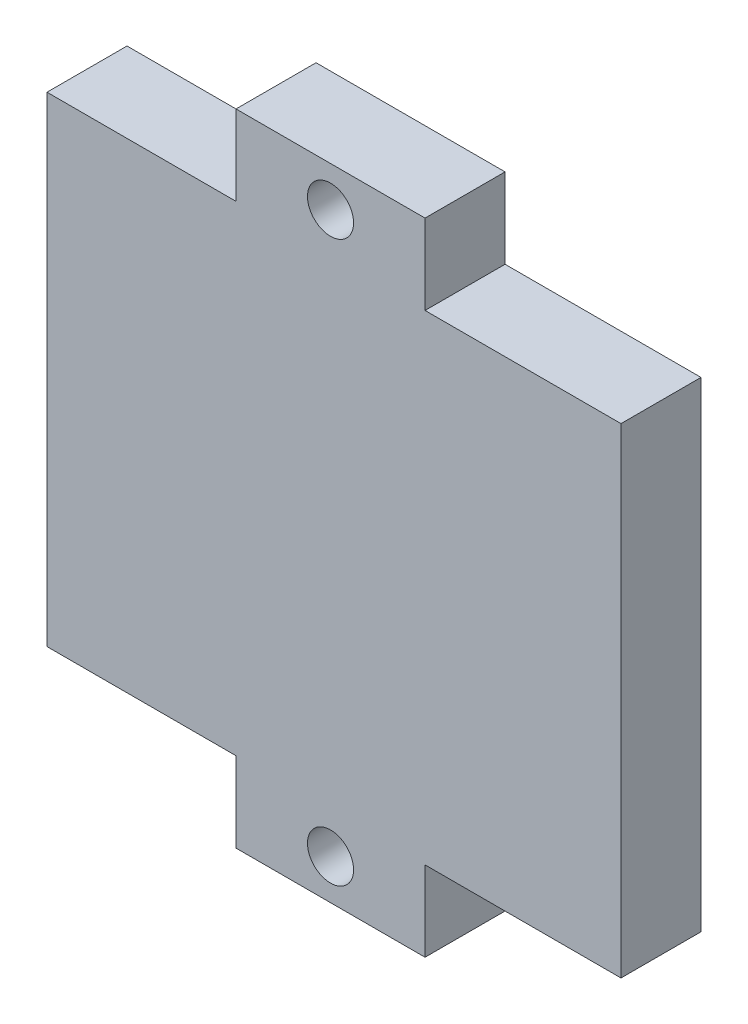
ISO-10303-21;
HEADER;
FILE_DESCRIPTION(('STEP AP214'),'2;1');
FILE_NAME('part.step','',(''),(''),'','','');
FILE_SCHEMA(('AUTOMOTIVE_DESIGN { 1 0 10303 214 1 1 1 1 }'));
ENDSEC;
DATA;
#1=APPLICATION_CONTEXT('core data for automotive mechanical design processes');
#2=APPLICATION_PROTOCOL_DEFINITION('international standard','automotive_design',2000,#1);
#3=PRODUCT_CONTEXT('',#1,'mechanical');
#4=PRODUCT('Part','Part','',(#3));
#5=PRODUCT_RELATED_PRODUCT_CATEGORY('part','',(#4));
#6=PRODUCT_DEFINITION_FORMATION('','',#4);
#7=PRODUCT_DEFINITION_CONTEXT('part definition',#1,'design');
#8=PRODUCT_DEFINITION('design','',#6,#7);
#9=PRODUCT_DEFINITION_SHAPE('','',#8);
#10=(LENGTH_UNIT() NAMED_UNIT(*) SI_UNIT(.MILLI.,.METRE.));
#11=(NAMED_UNIT(*) PLANE_ANGLE_UNIT() SI_UNIT($,.RADIAN.));
#12=(NAMED_UNIT(*) SI_UNIT($,.STERADIAN.) SOLID_ANGLE_UNIT());
#13=UNCERTAINTY_MEASURE_WITH_UNIT(LENGTH_MEASURE(1.E-05),#10,'distance_accuracy_value','');
#14=(GEOMETRIC_REPRESENTATION_CONTEXT(3) GLOBAL_UNCERTAINTY_ASSIGNED_CONTEXT((#13)) GLOBAL_UNIT_ASSIGNED_CONTEXT((#10,
#11,#12)) REPRESENTATION_CONTEXT('',''));
#15=CARTESIAN_POINT('',(0.,0.,0.));
#16=DIRECTION('',(0.,0.,1.));
#17=DIRECTION('',(1.,0.,0.));
#18=AXIS2_PLACEMENT_3D('',#15,#16,#17);
#19=CARTESIAN_POINT('',(0.,0.,6.35));
#20=DIRECTION('',(0.,0.,-1.));
#21=DIRECTION('',(-1.,0.,0.));
#22=AXIS2_PLACEMENT_3D('',#19,#20,#21);
#23=PLANE('',#22);
#24=CARTESIAN_POINT('',(-0.274999999999977,22.225,6.35));
#25=DIRECTION('',(0.,0.,1.));
#26=DIRECTION('',(1.,0.,0.));
#27=AXIS2_PLACEMENT_3D('',#24,#25,#26);
#28=CIRCLE('',#27,1.82879999999999);
#29=CARTESIAN_POINT('',(1.55380000000001,22.225,6.35));
#30=VERTEX_POINT('',#29);
#31=EDGE_CURVE('E254',#30,#30,#28,.T.);
#32=ORIENTED_EDGE('',*,*,#31,.F.);
#33=EDGE_LOOP('',(#32));
#34=FACE_BOUND('',#33,.T.);
#35=CARTESIAN_POINT('',(-0.274999999999977,-22.225,6.35));
#36=DIRECTION('',(0.,0.,1.));
#37=DIRECTION('',(1.,0.,0.));
#38=AXIS2_PLACEMENT_3D('',#35,#36,#37);
#39=CIRCLE('',#38,1.82879999999999);
#40=CARTESIAN_POINT('',(1.55380000000001,-22.225,6.35));
#41=VERTEX_POINT('',#40);
#42=EDGE_CURVE('E219',#41,#41,#39,.T.);
#43=ORIENTED_EDGE('',*,*,#42,.F.);
#44=EDGE_LOOP('',(#43));
#45=FACE_BOUND('',#44,.T.);
#46=DIRECTION('',(-1.,0.,0.));
#47=VECTOR('',#46,1.);
#48=CARTESIAN_POINT('',(22.775,19.05,6.35));
#49=LINE('',#48,#47);
#50=CARTESIAN_POINT('',(22.775,19.05,6.35));
#51=VERTEX_POINT('',#50);
#52=CARTESIAN_POINT('',(7.22500000000002,19.05,6.35));
#53=VERTEX_POINT('',#52);
#54=EDGE_CURVE('E55',#51,#53,#49,.T.);
#55=ORIENTED_EDGE('',*,*,#54,.T.);
#56=DIRECTION('',(0.,1.,0.));
#57=VECTOR('',#56,1.);
#58=CARTESIAN_POINT('',(7.22500000000002,25.4,6.35));
#59=LINE('',#58,#57);
#60=CARTESIAN_POINT('',(7.22500000000002,25.4,6.35));
#61=VERTEX_POINT('',#60);
#62=EDGE_CURVE('E245',#53,#61,#59,.T.);
#63=ORIENTED_EDGE('',*,*,#62,.T.);
#64=DIRECTION('',(-1.,0.,0.));
#65=VECTOR('',#64,1.);
#66=CARTESIAN_POINT('',(-22.775,25.4,6.35));
#67=LINE('',#66,#65);
#68=CARTESIAN_POINT('',(-7.77499999999998,25.4,6.35));
#69=VERTEX_POINT('',#68);
#70=EDGE_CURVE('E155',#61,#69,#67,.T.);
#71=ORIENTED_EDGE('',*,*,#70,.T.);
#72=DIRECTION('',(0.,-1.,0.));
#73=VECTOR('',#72,1.);
#74=CARTESIAN_POINT('',(-7.77499999999998,25.4,6.35));
#75=LINE('',#74,#73);
#76=CARTESIAN_POINT('',(-7.77499999999998,19.05,6.35));
#77=VERTEX_POINT('',#76);
#78=EDGE_CURVE('E228',#69,#77,#75,.T.);
#79=ORIENTED_EDGE('',*,*,#78,.T.);
#80=DIRECTION('',(-1.,0.,0.));
#81=VECTOR('',#80,1.);
#82=CARTESIAN_POINT('',(-22.775,19.05,6.35));
#83=LINE('',#82,#81);
#84=CARTESIAN_POINT('',(-22.775,19.05,6.35));
#85=VERTEX_POINT('',#84);
#86=EDGE_CURVE('E233',#77,#85,#83,.T.);
#87=ORIENTED_EDGE('',*,*,#86,.T.);
#88=DIRECTION('',(0.,-1.,0.));
#89=VECTOR('',#88,1.);
#90=CARTESIAN_POINT('',(-22.775,-25.4,6.35));
#91=LINE('',#90,#89);
#92=CARTESIAN_POINT('',(-22.775,-19.05,6.35));
#93=VERTEX_POINT('',#92);
#94=EDGE_CURVE('E47',#85,#93,#91,.T.);
#95=ORIENTED_EDGE('',*,*,#94,.T.);
#96=DIRECTION('',(-1.,0.,0.));
#97=VECTOR('',#96,1.);
#98=CARTESIAN_POINT('',(-22.775,-19.05,6.35));
#99=LINE('',#98,#97);
#100=CARTESIAN_POINT('',(-7.77499999999998,-19.05,6.35));
#101=VERTEX_POINT('',#100);
#102=EDGE_CURVE('E187',#101,#93,#99,.T.);
#103=ORIENTED_EDGE('',*,*,#102,.F.);
#104=DIRECTION('',(0.,1.,0.));
#105=VECTOR('',#104,1.);
#106=CARTESIAN_POINT('',(-7.77499999999998,-25.4,6.35));
#107=LINE('',#106,#105);
#108=CARTESIAN_POINT('',(-7.77499999999998,-25.4,6.35));
#109=VERTEX_POINT('',#108);
#110=EDGE_CURVE('E191',#109,#101,#107,.T.);
#111=ORIENTED_EDGE('',*,*,#110,.F.);
#112=DIRECTION('',(1.,0.,0.));
#113=VECTOR('',#112,1.);
#114=CARTESIAN_POINT('',(-22.775,-25.4,6.35));
#115=LINE('',#114,#113);
#116=CARTESIAN_POINT('',(7.22500000000002,-25.4,6.35));
#117=VERTEX_POINT('',#116);
#118=EDGE_CURVE('E11',#109,#117,#115,.T.);
#119=ORIENTED_EDGE('',*,*,#118,.T.);
#120=DIRECTION('',(0.,-1.,0.));
#121=VECTOR('',#120,1.);
#122=CARTESIAN_POINT('',(7.22500000000002,-25.4,6.35));
#123=LINE('',#122,#121);
#124=CARTESIAN_POINT('',(7.22500000000002,-19.05,6.35));
#125=VERTEX_POINT('',#124);
#126=EDGE_CURVE('E206',#125,#117,#123,.T.);
#127=ORIENTED_EDGE('',*,*,#126,.F.);
#128=DIRECTION('',(-1.,0.,0.));
#129=VECTOR('',#128,1.);
#130=CARTESIAN_POINT('',(22.775,-19.05,6.35));
#131=LINE('',#130,#129);
#132=CARTESIAN_POINT('',(22.775,-19.05,6.35));
#133=VERTEX_POINT('',#132);
#134=EDGE_CURVE('E209',#133,#125,#131,.T.);
#135=ORIENTED_EDGE('',*,*,#134,.F.);
#136=DIRECTION('',(0.,1.,0.));
#137=VECTOR('',#136,1.);
#138=CARTESIAN_POINT('',(22.775,-25.4,6.35));
#139=LINE('',#138,#137);
#140=EDGE_CURVE('E177',#133,#51,#139,.T.);
#141=ORIENTED_EDGE('',*,*,#140,.T.);
#142=EDGE_LOOP('',(#55,#63,#71,#79,#87,#95,#103,#111,#119,#127,#135,#141));
#143=FACE_BOUND('',#142,.T.);
#144=ADVANCED_FACE('F38',(#34,#45,#143),#23,.F.);
#145=CARTESIAN_POINT('',(-22.775,25.4,6.35));
#146=DIRECTION('',(0.,-1.,0.));
#147=DIRECTION('',(0.,0.,-1.));
#148=AXIS2_PLACEMENT_3D('',#145,#146,#147);
#149=PLANE('',#148);
#150=DIRECTION('',(0.,0.,1.));
#151=VECTOR('',#150,1.);
#152=CARTESIAN_POINT('',(7.22500000000002,25.4,0.));
#153=LINE('',#152,#151);
#154=CARTESIAN_POINT('',(7.22500000000002,25.4,0.));
#155=VERTEX_POINT('',#154);
#156=EDGE_CURVE('E140',#155,#61,#153,.T.);
#157=ORIENTED_EDGE('',*,*,#156,.F.);
#158=DIRECTION('',(-1.,0.,0.));
#159=VECTOR('',#158,1.);
#160=CARTESIAN_POINT('',(-22.775,25.4,0.));
#161=LINE('',#160,#159);
#162=CARTESIAN_POINT('',(-7.77499999999998,25.4,0.));
#163=VERTEX_POINT('',#162);
#164=EDGE_CURVE('E153',#155,#163,#161,.T.);
#165=ORIENTED_EDGE('',*,*,#164,.T.);
#166=DIRECTION('',(0.,0.,1.));
#167=VECTOR('',#166,1.);
#168=CARTESIAN_POINT('',(-7.77499999999998,25.4,0.));
#169=LINE('',#168,#167);
#170=EDGE_CURVE('E222',#163,#69,#169,.T.);
#171=ORIENTED_EDGE('',*,*,#170,.T.);
#172=ORIENTED_EDGE('',*,*,#70,.F.);
#173=EDGE_LOOP('',(#157,#165,#171,#172));
#174=FACE_BOUND('',#173,.T.);
#175=ADVANCED_FACE('F151',(#174),#149,.F.);
#176=CARTESIAN_POINT('',(0.,0.,0.));
#177=DIRECTION('',(0.,0.,-1.));
#178=DIRECTION('',(-1.,0.,0.));
#179=AXIS2_PLACEMENT_3D('',#176,#177,#178);
#180=PLANE('',#179);
#181=CARTESIAN_POINT('',(-0.274999999999977,22.225,0.));
#182=DIRECTION('',(0.,0.,-1.));
#183=DIRECTION('',(-1.,0.,0.));
#184=AXIS2_PLACEMENT_3D('',#181,#182,#183);
#185=CIRCLE('',#184,1.82879999999999);
#186=CARTESIAN_POINT('',(-2.10379999999997,22.225,0.));
#187=VERTEX_POINT('',#186);
#188=EDGE_CURVE('E248',#187,#187,#185,.T.);
#189=ORIENTED_EDGE('',*,*,#188,.F.);
#190=EDGE_LOOP('',(#189));
#191=FACE_BOUND('',#190,.T.);
#192=CARTESIAN_POINT('',(-0.274999999999977,-22.225,0.));
#193=DIRECTION('',(0.,0.,-1.));
#194=DIRECTION('',(-1.,0.,0.));
#195=AXIS2_PLACEMENT_3D('',#192,#193,#194);
#196=CIRCLE('',#195,1.82879999999999);
#197=CARTESIAN_POINT('',(-2.10379999999997,-22.225,0.));
#198=VERTEX_POINT('',#197);
#199=EDGE_CURVE('E212',#198,#198,#196,.T.);
#200=ORIENTED_EDGE('',*,*,#199,.F.);
#201=EDGE_LOOP('',(#200));
#202=FACE_BOUND('',#201,.T.);
#203=DIRECTION('',(0.,1.,0.));
#204=VECTOR('',#203,1.);
#205=CARTESIAN_POINT('',(7.22500000000002,25.4,0.));
#206=LINE('',#205,#204);
#207=CARTESIAN_POINT('',(7.22500000000002,19.05,0.));
#208=VERTEX_POINT('',#207);
#209=EDGE_CURVE('E136',#208,#155,#206,.T.);
#210=ORIENTED_EDGE('',*,*,#209,.F.);
#211=DIRECTION('',(-1.,0.,0.));
#212=VECTOR('',#211,1.);
#213=CARTESIAN_POINT('',(22.775,19.05,0.));
#214=LINE('',#213,#212);
#215=CARTESIAN_POINT('',(22.775,19.05,0.));
#216=VERTEX_POINT('',#215);
#217=EDGE_CURVE('E147',#216,#208,#214,.T.);
#218=ORIENTED_EDGE('',*,*,#217,.F.);
#219=DIRECTION('',(0.,1.,0.));
#220=VECTOR('',#219,1.);
#221=CARTESIAN_POINT('',(22.775,-25.4,0.));
#222=LINE('',#221,#220);
#223=CARTESIAN_POINT('',(22.775,-19.05,0.));
#224=VERTEX_POINT('',#223);
#225=EDGE_CURVE('E164',#224,#216,#222,.T.);
#226=ORIENTED_EDGE('',*,*,#225,.F.);
#227=DIRECTION('',(-1.,0.,0.));
#228=VECTOR('',#227,1.);
#229=CARTESIAN_POINT('',(22.775,-19.05,0.));
#230=LINE('',#229,#228);
#231=CARTESIAN_POINT('',(7.22500000000002,-19.05,0.));
#232=VERTEX_POINT('',#231);
#233=EDGE_CURVE('E208',#224,#232,#230,.T.);
#234=ORIENTED_EDGE('',*,*,#233,.T.);
#235=DIRECTION('',(0.,-1.,0.));
#236=VECTOR('',#235,1.);
#237=CARTESIAN_POINT('',(7.22500000000002,-25.4,0.));
#238=LINE('',#237,#236);
#239=CARTESIAN_POINT('',(7.22500000000002,-25.4,0.));
#240=VERTEX_POINT('',#239);
#241=EDGE_CURVE('E202',#232,#240,#238,.T.);
#242=ORIENTED_EDGE('',*,*,#241,.T.);
#243=DIRECTION('',(1.,0.,0.));
#244=VECTOR('',#243,1.);
#245=CARTESIAN_POINT('',(-22.775,-25.4,0.));
#246=LINE('',#245,#244);
#247=CARTESIAN_POINT('',(-7.77499999999998,-25.4,0.));
#248=VERTEX_POINT('',#247);
#249=EDGE_CURVE('E42',#248,#240,#246,.T.);
#250=ORIENTED_EDGE('',*,*,#249,.F.);
#251=DIRECTION('',(0.,1.,0.));
#252=VECTOR('',#251,1.);
#253=CARTESIAN_POINT('',(-7.77499999999998,-25.4,0.));
#254=LINE('',#253,#252);
#255=CARTESIAN_POINT('',(-7.77499999999998,-19.05,0.));
#256=VERTEX_POINT('',#255);
#257=EDGE_CURVE('E190',#248,#256,#254,.T.);
#258=ORIENTED_EDGE('',*,*,#257,.T.);
#259=DIRECTION('',(-1.,0.,0.));
#260=VECTOR('',#259,1.);
#261=CARTESIAN_POINT('',(-22.775,-19.05,0.));
#262=LINE('',#261,#260);
#263=CARTESIAN_POINT('',(-22.775,-19.05,0.));
#264=VERTEX_POINT('',#263);
#265=EDGE_CURVE('E183',#256,#264,#262,.T.);
#266=ORIENTED_EDGE('',*,*,#265,.T.);
#267=DIRECTION('',(0.,-1.,0.));
#268=VECTOR('',#267,1.);
#269=CARTESIAN_POINT('',(-22.775,-25.4,0.));
#270=LINE('',#269,#268);
#271=CARTESIAN_POINT('',(-22.775,19.05,0.));
#272=VERTEX_POINT('',#271);
#273=EDGE_CURVE('E163',#272,#264,#270,.T.);
#274=ORIENTED_EDGE('',*,*,#273,.F.);
#275=DIRECTION('',(-1.,0.,0.));
#276=VECTOR('',#275,1.);
#277=CARTESIAN_POINT('',(-22.775,19.05,0.));
#278=LINE('',#277,#276);
#279=CARTESIAN_POINT('',(-7.77499999999998,19.05,0.));
#280=VERTEX_POINT('',#279);
#281=EDGE_CURVE('E232',#280,#272,#278,.T.);
#282=ORIENTED_EDGE('',*,*,#281,.F.);
#283=DIRECTION('',(0.,-1.,0.));
#284=VECTOR('',#283,1.);
#285=CARTESIAN_POINT('',(-7.77499999999998,25.4,0.));
#286=LINE('',#285,#284);
#287=EDGE_CURVE('E161',#163,#280,#286,.T.);
#288=ORIENTED_EDGE('',*,*,#287,.F.);
#289=ORIENTED_EDGE('',*,*,#164,.F.);
#290=EDGE_LOOP('',(#210,#218,#226,#234,#242,#250,#258,#266,#274,#282,#288,#289));
#291=FACE_BOUND('',#290,.T.);
#292=ADVANCED_FACE('F159',(#191,#202,#291),#180,.T.);
#293=CARTESIAN_POINT('',(22.775,-25.4,6.35));
#294=DIRECTION('',(-1.,0.,0.));
#295=DIRECTION('',(0.,0.,1.));
#296=AXIS2_PLACEMENT_3D('',#293,#294,#295);
#297=PLANE('',#296);
#298=DIRECTION('',(0.,0.,1.));
#299=VECTOR('',#298,1.);
#300=CARTESIAN_POINT('',(22.775,19.05,0.));
#301=LINE('',#300,#299);
#302=EDGE_CURVE('E237',#216,#51,#301,.T.);
#303=ORIENTED_EDGE('',*,*,#302,.T.);
#304=ORIENTED_EDGE('',*,*,#140,.F.);
#305=DIRECTION('',(0.,0.,1.));
#306=VECTOR('',#305,1.);
#307=CARTESIAN_POINT('',(22.775,-19.05,0.));
#308=LINE('',#307,#306);
#309=EDGE_CURVE('E199',#224,#133,#308,.T.);
#310=ORIENTED_EDGE('',*,*,#309,.F.);
#311=ORIENTED_EDGE('',*,*,#225,.T.);
#312=EDGE_LOOP('',(#303,#304,#310,#311));
#313=FACE_BOUND('',#312,.T.);
#314=ADVANCED_FACE('F40',(#313),#297,.F.);
#315=CARTESIAN_POINT('',(-22.775,-25.4,6.35));
#316=DIRECTION('',(1.,0.,0.));
#317=DIRECTION('',(0.,0.,-1.));
#318=AXIS2_PLACEMENT_3D('',#315,#316,#317);
#319=PLANE('',#318);
#320=DIRECTION('',(0.,0.,1.));
#321=VECTOR('',#320,1.);
#322=CARTESIAN_POINT('',(-22.775,19.05,0.));
#323=LINE('',#322,#321);
#324=EDGE_CURVE('E223',#272,#85,#323,.T.);
#325=ORIENTED_EDGE('',*,*,#324,.F.);
#326=ORIENTED_EDGE('',*,*,#273,.T.);
#327=DIRECTION('',(0.,0.,1.));
#328=VECTOR('',#327,1.);
#329=CARTESIAN_POINT('',(-22.775,-19.05,0.));
#330=LINE('',#329,#328);
#331=EDGE_CURVE('E170',#264,#93,#330,.T.);
#332=ORIENTED_EDGE('',*,*,#331,.T.);
#333=ORIENTED_EDGE('',*,*,#94,.F.);
#334=EDGE_LOOP('',(#325,#326,#332,#333));
#335=FACE_BOUND('',#334,.T.);
#336=ADVANCED_FACE('F297',(#335),#319,.F.);
#337=CARTESIAN_POINT('',(-22.775,-25.4,6.35));
#338=DIRECTION('',(0.,1.,0.));
#339=DIRECTION('',(0.,0.,1.));
#340=AXIS2_PLACEMENT_3D('',#337,#338,#339);
#341=PLANE('',#340);
#342=ORIENTED_EDGE('',*,*,#249,.T.);
#343=DIRECTION('',(0.,0.,1.));
#344=VECTOR('',#343,1.);
#345=CARTESIAN_POINT('',(7.22500000000002,-25.4,0.));
#346=LINE('',#345,#344);
#347=EDGE_CURVE('E194',#240,#117,#346,.T.);
#348=ORIENTED_EDGE('',*,*,#347,.T.);
#349=ORIENTED_EDGE('',*,*,#118,.F.);
#350=DIRECTION('',(0.,0.,1.));
#351=VECTOR('',#350,1.);
#352=CARTESIAN_POINT('',(-7.77499999999998,-25.4,0.));
#353=LINE('',#352,#351);
#354=EDGE_CURVE('E180',#248,#109,#353,.T.);
#355=ORIENTED_EDGE('',*,*,#354,.F.);
#356=EDGE_LOOP('',(#342,#348,#349,#355));
#357=FACE_BOUND('',#356,.T.);
#358=ADVANCED_FACE('F283',(#357),#341,.F.);
#359=CARTESIAN_POINT('',(-22.775,-19.05,0.));
#360=DIRECTION('',(0.,1.,0.));
#361=DIRECTION('',(0.,0.,1.));
#362=AXIS2_PLACEMENT_3D('',#359,#360,#361);
#363=PLANE('',#362);
#364=ORIENTED_EDGE('',*,*,#102,.T.);
#365=ORIENTED_EDGE('',*,*,#331,.F.);
#366=ORIENTED_EDGE('',*,*,#265,.F.);
#367=DIRECTION('',(0.,0.,1.));
#368=VECTOR('',#367,1.);
#369=CARTESIAN_POINT('',(-7.77499999999998,-19.05,0.));
#370=LINE('',#369,#368);
#371=EDGE_CURVE('E182',#256,#101,#370,.T.);
#372=ORIENTED_EDGE('',*,*,#371,.T.);
#373=EDGE_LOOP('',(#364,#365,#366,#372));
#374=FACE_BOUND('',#373,.T.);
#375=ADVANCED_FACE('F293',(#374),#363,.F.);
#376=CARTESIAN_POINT('',(-7.77499999999998,-25.4,0.));
#377=DIRECTION('',(1.,0.,0.));
#378=DIRECTION('',(0.,0.,-1.));
#379=AXIS2_PLACEMENT_3D('',#376,#377,#378);
#380=PLANE('',#379);
#381=ORIENTED_EDGE('',*,*,#110,.T.);
#382=ORIENTED_EDGE('',*,*,#371,.F.);
#383=ORIENTED_EDGE('',*,*,#257,.F.);
#384=ORIENTED_EDGE('',*,*,#354,.T.);
#385=EDGE_LOOP('',(#381,#382,#383,#384));
#386=FACE_BOUND('',#385,.T.);
#387=ADVANCED_FACE('F289',(#386),#380,.F.);
#388=CARTESIAN_POINT('',(7.22500000000002,-25.4,0.));
#389=DIRECTION('',(-1.,0.,0.));
#390=DIRECTION('',(0.,-1.,0.));
#391=AXIS2_PLACEMENT_3D('',#388,#389,#390);
#392=PLANE('',#391);
#393=ORIENTED_EDGE('',*,*,#126,.T.);
#394=ORIENTED_EDGE('',*,*,#347,.F.);
#395=ORIENTED_EDGE('',*,*,#241,.F.);
#396=DIRECTION('',(0.,0.,1.));
#397=VECTOR('',#396,1.);
#398=CARTESIAN_POINT('',(7.22500000000002,-19.05,0.));
#399=LINE('',#398,#397);
#400=EDGE_CURVE('E201',#232,#125,#399,.T.);
#401=ORIENTED_EDGE('',*,*,#400,.T.);
#402=EDGE_LOOP('',(#393,#394,#395,#401));
#403=FACE_BOUND('',#402,.T.);
#404=ADVANCED_FACE('F280',(#403),#392,.F.);
#405=CARTESIAN_POINT('',(22.775,-19.05,0.));
#406=DIRECTION('',(0.,1.,0.));
#407=DIRECTION('',(-1.,0.,0.));
#408=AXIS2_PLACEMENT_3D('',#405,#406,#407);
#409=PLANE('',#408);
#410=ORIENTED_EDGE('',*,*,#134,.T.);
#411=ORIENTED_EDGE('',*,*,#400,.F.);
#412=ORIENTED_EDGE('',*,*,#233,.F.);
#413=ORIENTED_EDGE('',*,*,#309,.T.);
#414=EDGE_LOOP('',(#410,#411,#412,#413));
#415=FACE_BOUND('',#414,.T.);
#416=ADVANCED_FACE('F278',(#415),#409,.F.);
#417=CARTESIAN_POINT('',(-0.274999999999977,-22.225,6.35));
#418=DIRECTION('',(0.,0.,1.));
#419=DIRECTION('',(1.,0.,0.));
#420=AXIS2_PLACEMENT_3D('',#417,#418,#419);
#421=CYLINDRICAL_SURFACE('',#420,1.82879999999999);
#422=ORIENTED_EDGE('',*,*,#42,.T.);
#423=EDGE_LOOP('',(#422));
#424=FACE_BOUND('',#423,.T.);
#425=ORIENTED_EDGE('',*,*,#199,.T.);
#426=EDGE_LOOP('',(#425));
#427=FACE_BOUND('',#426,.T.);
#428=ADVANCED_FACE('F303',(#424,#427),#421,.F.);
#429=CARTESIAN_POINT('',(-7.77499999999998,25.4,0.));
#430=DIRECTION('',(-1.,0.,0.));
#431=DIRECTION('',(0.,0.,1.));
#432=AXIS2_PLACEMENT_3D('',#429,#430,#431);
#433=PLANE('',#432);
#434=ORIENTED_EDGE('',*,*,#78,.F.);
#435=ORIENTED_EDGE('',*,*,#170,.F.);
#436=ORIENTED_EDGE('',*,*,#287,.T.);
#437=DIRECTION('',(0.,0.,1.));
#438=VECTOR('',#437,1.);
#439=CARTESIAN_POINT('',(-7.77499999999998,19.05,0.));
#440=LINE('',#439,#438);
#441=EDGE_CURVE('E66',#280,#77,#440,.T.);
#442=ORIENTED_EDGE('',*,*,#441,.T.);
#443=EDGE_LOOP('',(#434,#435,#436,#442));
#444=FACE_BOUND('',#443,.T.);
#445=ADVANCED_FACE('F301',(#444),#433,.T.);
#446=CARTESIAN_POINT('',(-22.775,19.05,0.));
#447=DIRECTION('',(0.,1.,0.));
#448=DIRECTION('',(0.,0.,1.));
#449=AXIS2_PLACEMENT_3D('',#446,#447,#448);
#450=PLANE('',#449);
#451=ORIENTED_EDGE('',*,*,#86,.F.);
#452=ORIENTED_EDGE('',*,*,#441,.F.);
#453=ORIENTED_EDGE('',*,*,#281,.T.);
#454=ORIENTED_EDGE('',*,*,#324,.T.);
#455=EDGE_LOOP('',(#451,#452,#453,#454));
#456=FACE_BOUND('',#455,.T.);
#457=ADVANCED_FACE('F298',(#456),#450,.T.);
#458=CARTESIAN_POINT('',(22.775,19.05,0.));
#459=DIRECTION('',(0.,1.,0.));
#460=DIRECTION('',(-1.,0.,0.));
#461=AXIS2_PLACEMENT_3D('',#458,#459,#460);
#462=PLANE('',#461);
#463=ORIENTED_EDGE('',*,*,#54,.F.);
#464=ORIENTED_EDGE('',*,*,#302,.F.);
#465=ORIENTED_EDGE('',*,*,#217,.T.);
#466=DIRECTION('',(0.,0.,1.));
#467=VECTOR('',#466,1.);
#468=CARTESIAN_POINT('',(7.22500000000002,19.05,0.));
#469=LINE('',#468,#467);
#470=EDGE_CURVE('E142',#208,#53,#469,.T.);
#471=ORIENTED_EDGE('',*,*,#470,.T.);
#472=EDGE_LOOP('',(#463,#464,#465,#471));
#473=FACE_BOUND('',#472,.T.);
#474=ADVANCED_FACE('F273',(#473),#462,.T.);
#475=CARTESIAN_POINT('',(7.22500000000002,25.4,0.));
#476=DIRECTION('',(1.,0.,0.));
#477=DIRECTION('',(0.,1.,0.));
#478=AXIS2_PLACEMENT_3D('',#475,#476,#477);
#479=PLANE('',#478);
#480=ORIENTED_EDGE('',*,*,#62,.F.);
#481=ORIENTED_EDGE('',*,*,#470,.F.);
#482=ORIENTED_EDGE('',*,*,#209,.T.);
#483=ORIENTED_EDGE('',*,*,#156,.T.);
#484=EDGE_LOOP('',(#480,#481,#482,#483));
#485=FACE_BOUND('',#484,.T.);
#486=ADVANCED_FACE('F139',(#485),#479,.T.);
#487=CARTESIAN_POINT('',(-0.274999999999977,22.225,6.35));
#488=DIRECTION('',(0.,0.,1.));
#489=DIRECTION('',(1.,0.,0.));
#490=AXIS2_PLACEMENT_3D('',#487,#488,#489);
#491=CYLINDRICAL_SURFACE('',#490,1.82879999999999);
#492=ORIENTED_EDGE('',*,*,#31,.T.);
#493=EDGE_LOOP('',(#492));
#494=FACE_BOUND('',#493,.T.);
#495=ORIENTED_EDGE('',*,*,#188,.T.);
#496=EDGE_LOOP('',(#495));
#497=FACE_BOUND('',#496,.T.);
#498=ADVANCED_FACE('F259',(#494,#497),#491,.F.);
#499=CLOSED_SHELL('',(#144,#175,#292,#314,#336,#358,#375,#387,#404,#416,#428,#445,#457,#474,
#486,#498));
#500=MANIFOLD_SOLID_BREP('B2',#499);
#501=ADVANCED_BREP_SHAPE_REPRESENTATION('',(#18,#500),#14);
#502=SHAPE_DEFINITION_REPRESENTATION(#9,#501);
ENDSEC;
END-ISO-10303-21;
